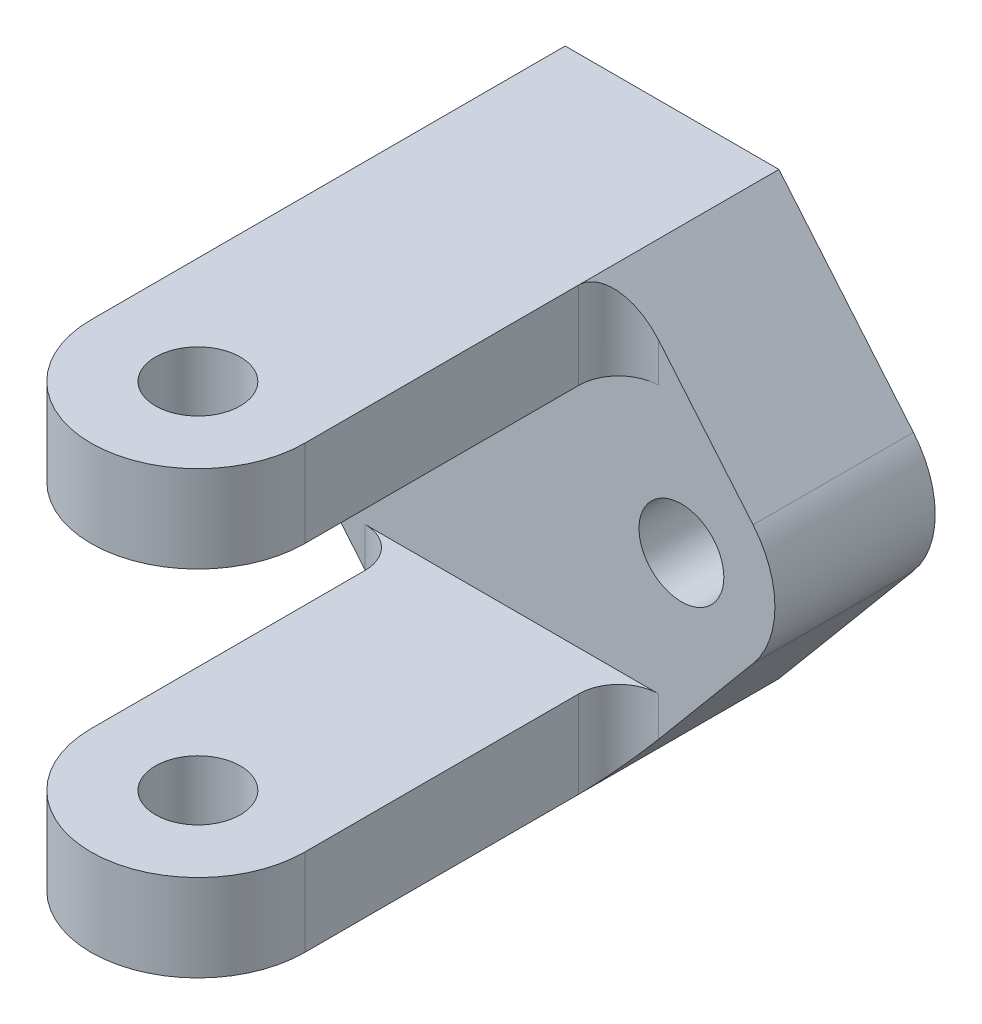
ISO-10303-21;
HEADER;
FILE_DESCRIPTION(('STEP AP214'),'2;1');
FILE_NAME('part.step','',(''),(''),'','','');
FILE_SCHEMA(('AUTOMOTIVE_DESIGN { 1 0 10303 214 1 1 1 1 }'));
ENDSEC;
DATA;
#1=APPLICATION_CONTEXT('core data for automotive mechanical design processes');
#2=APPLICATION_PROTOCOL_DEFINITION('international standard','automotive_design',2000,#1);
#3=PRODUCT_CONTEXT('',#1,'mechanical');
#4=PRODUCT('Part','Part','',(#3));
#5=PRODUCT_RELATED_PRODUCT_CATEGORY('part','',(#4));
#6=PRODUCT_DEFINITION_FORMATION('','',#4);
#7=PRODUCT_DEFINITION_CONTEXT('part definition',#1,'design');
#8=PRODUCT_DEFINITION('design','',#6,#7);
#9=PRODUCT_DEFINITION_SHAPE('','',#8);
#10=(LENGTH_UNIT() NAMED_UNIT(*) SI_UNIT(.MILLI.,.METRE.));
#11=(NAMED_UNIT(*) PLANE_ANGLE_UNIT() SI_UNIT($,.RADIAN.));
#12=(NAMED_UNIT(*) SI_UNIT($,.STERADIAN.) SOLID_ANGLE_UNIT());
#13=UNCERTAINTY_MEASURE_WITH_UNIT(LENGTH_MEASURE(1.E-05),#10,'distance_accuracy_value','');
#14=(GEOMETRIC_REPRESENTATION_CONTEXT(3) GLOBAL_UNCERTAINTY_ASSIGNED_CONTEXT((#13)) GLOBAL_UNIT_ASSIGNED_CONTEXT((#10,
#11,#12)) REPRESENTATION_CONTEXT('',''));
#15=CARTESIAN_POINT('',(0.,0.,0.));
#16=DIRECTION('',(0.,0.,1.));
#17=DIRECTION('',(1.,0.,0.));
#18=AXIS2_PLACEMENT_3D('',#15,#16,#17);
#19=CARTESIAN_POINT('',(-8.,-83.7629553253982,20.));
#20=DIRECTION('',(1.,0.,0.));
#21=DIRECTION('',(0.,0.,-1.));
#22=AXIS2_PLACEMENT_3D('',#19,#20,#21);
#23=PLANE('',#22);
#24=DIRECTION('',(0.,0.,1.));
#25=VECTOR('',#24,1.);
#26=CARTESIAN_POINT('',(-8.,16.51,20.));
#27=LINE('',#26,#25);
#28=CARTESIAN_POINT('',(-8.,16.51,15.));
#29=VERTEX_POINT('',#28);
#30=CARTESIAN_POINT('',(-8.,16.51,35.5));
#31=VERTEX_POINT('',#30);
#32=EDGE_CURVE('E193',#29,#31,#27,.T.);
#33=ORIENTED_EDGE('',*,*,#32,.F.);
#34=DIRECTION('',(0.,1.,0.));
#35=VECTOR('',#34,1.);
#36=CARTESIAN_POINT('',(-8.,9.99999999999999,15.));
#37=LINE('',#36,#35);
#38=CARTESIAN_POINT('',(-8.,10.,15.));
#39=VERTEX_POINT('',#38);
#40=EDGE_CURVE('E323',#29,#39,#37,.F.);
#41=ORIENTED_EDGE('',*,*,#40,.T.);
#42=DIRECTION('',(0.,0.,-1.));
#43=VECTOR('',#42,1.);
#44=CARTESIAN_POINT('',(-8.,10.,65.));
#45=LINE('',#44,#43);
#46=CARTESIAN_POINT('',(-8.,9.99999999999999,35.5));
#47=VERTEX_POINT('',#46);
#48=EDGE_CURVE('E249',#47,#39,#45,.T.);
#49=ORIENTED_EDGE('',*,*,#48,.F.);
#50=DIRECTION('',(0.,1.,0.));
#51=VECTOR('',#50,1.);
#52=CARTESIAN_POINT('',(-8.,-83.7629553253982,35.5));
#53=LINE('',#52,#51);
#54=EDGE_CURVE('E238',#47,#31,#53,.T.);
#55=ORIENTED_EDGE('',*,*,#54,.T.);
#56=EDGE_LOOP('',(#33,#41,#49,#55));
#57=FACE_BOUND('',#56,.T.);
#58=ADVANCED_FACE('F44',(#57),#23,.F.);
#59=CARTESIAN_POINT('',(8.,-83.7629553253982,35.5));
#60=DIRECTION('',(-1.,0.,0.));
#61=DIRECTION('',(0.,0.,1.));
#62=AXIS2_PLACEMENT_3D('',#59,#60,#61);
#63=PLANE('',#62);
#64=DIRECTION('',(0.,0.,1.));
#65=VECTOR('',#64,1.);
#66=CARTESIAN_POINT('',(8.,10.,65.));
#67=LINE('',#66,#65);
#68=CARTESIAN_POINT('',(8.,10.,15.));
#69=VERTEX_POINT('',#68);
#70=CARTESIAN_POINT('',(8.,9.99999999999999,35.5));
#71=VERTEX_POINT('',#70);
#72=EDGE_CURVE('E234',#69,#71,#67,.T.);
#73=ORIENTED_EDGE('',*,*,#72,.F.);
#74=DIRECTION('',(0.,1.,0.));
#75=VECTOR('',#74,1.);
#76=CARTESIAN_POINT('',(8.,16.51,15.));
#77=LINE('',#76,#75);
#78=CARTESIAN_POINT('',(8.,16.51,15.));
#79=VERTEX_POINT('',#78);
#80=EDGE_CURVE('E333',#69,#79,#77,.T.);
#81=ORIENTED_EDGE('',*,*,#80,.T.);
#82=DIRECTION('',(0.,0.,-1.));
#83=VECTOR('',#82,1.);
#84=CARTESIAN_POINT('',(8.,16.51,35.5));
#85=LINE('',#84,#83);
#86=CARTESIAN_POINT('',(8.,16.51,35.5));
#87=VERTEX_POINT('',#86);
#88=EDGE_CURVE('E218',#87,#79,#85,.T.);
#89=ORIENTED_EDGE('',*,*,#88,.F.);
#90=DIRECTION('',(0.,1.,0.));
#91=VECTOR('',#90,1.);
#92=CARTESIAN_POINT('',(8.,-83.7629553253982,35.5));
#93=LINE('',#92,#91);
#94=EDGE_CURVE('E222',#71,#87,#93,.T.);
#95=ORIENTED_EDGE('',*,*,#94,.F.);
#96=EDGE_LOOP('',(#73,#81,#89,#95));
#97=FACE_BOUND('',#96,.T.);
#98=ADVANCED_FACE('F383',(#97),#63,.F.);
#99=CARTESIAN_POINT('',(12.7,0.,47.3781062240477));
#100=DIRECTION('',(0.,0.,-1.));
#101=DIRECTION('',(-1.,0.,0.));
#102=AXIS2_PLACEMENT_3D('',#99,#100,#101);
#103=CYLINDRICAL_SURFACE('',#102,7.);
#104=CARTESIAN_POINT('',(12.7,0.,0.));
#105=DIRECTION('',(0.,0.,1.));
#106=DIRECTION('',(1.,0.,0.));
#107=AXIS2_PLACEMENT_3D('',#104,#105,#106);
#108=CIRCLE('',#107,7.);
#109=CARTESIAN_POINT('',(18.0657591468047,4.49540084736414,0.));
#110=VERTEX_POINT('',#109);
#111=CARTESIAN_POINT('',(18.0657591468047,-4.49540084736414,0.));
#112=VERTEX_POINT('',#111);
#113=EDGE_CURVE('E209',#110,#112,#108,.F.);
#114=ORIENTED_EDGE('',*,*,#113,.F.);
#115=DIRECTION('',(0.,0.,-1.));
#116=VECTOR('',#115,1.);
#117=CARTESIAN_POINT('',(18.0657591468047,4.49540084736414,27.6738667851937));
#118=LINE('',#117,#116);
#119=CARTESIAN_POINT('',(18.0657591468047,4.49540084736414,12.));
#120=VERTEX_POINT('',#119);
#121=EDGE_CURVE('E375',#120,#110,#118,.T.);
#122=ORIENTED_EDGE('',*,*,#121,.F.);
#123=CARTESIAN_POINT('',(12.7,0.,12.));
#124=DIRECTION('',(0.,0.,-1.));
#125=DIRECTION('',(-1.,0.,0.));
#126=AXIS2_PLACEMENT_3D('',#123,#124,#125);
#127=CIRCLE('',#126,7.);
#128=CARTESIAN_POINT('',(18.0657591468046,-4.49540084736413,12.));
#129=VERTEX_POINT('',#128);
#130=EDGE_CURVE('E200',#129,#120,#127,.F.);
#131=ORIENTED_EDGE('',*,*,#130,.F.);
#132=DIRECTION('',(0.,0.,-1.));
#133=VECTOR('',#132,1.);
#134=CARTESIAN_POINT('',(18.0657591468047,-4.49540084736414,27.6738667851937));
#135=LINE('',#134,#133);
#136=EDGE_CURVE('E203',#129,#112,#135,.T.);
#137=ORIENTED_EDGE('',*,*,#136,.T.);
#138=EDGE_LOOP('',(#114,#122,#131,#137));
#139=FACE_BOUND('',#138,.T.);
#140=ADVANCED_FACE('F445',(#139),#103,.T.);
#141=DIRECTION('',(0.,0.,1.));
#142=VECTOR('',#141,1.);
#143=CARTESIAN_POINT('',(-8.,-10.,65.));
#144=LINE('',#143,#142);
#145=CARTESIAN_POINT('',(-8.,-10.,15.));
#146=VERTEX_POINT('',#145);
#147=CARTESIAN_POINT('',(-8.,-9.99999999999999,35.5));
#148=VERTEX_POINT('',#147);
#149=EDGE_CURVE('E306',#146,#148,#144,.T.);
#150=ORIENTED_EDGE('',*,*,#149,.F.);
#151=DIRECTION('',(0.,-1.,0.));
#152=VECTOR('',#151,1.);
#153=CARTESIAN_POINT('',(-8.,-16.51,15.));
#154=LINE('',#153,#152);
#155=CARTESIAN_POINT('',(-8.,-16.51,15.));
#156=VERTEX_POINT('',#155);
#157=EDGE_CURVE('E326',#146,#156,#154,.T.);
#158=ORIENTED_EDGE('',*,*,#157,.T.);
#159=DIRECTION('',(0.,0.,1.));
#160=VECTOR('',#159,1.);
#161=CARTESIAN_POINT('',(-8.,-16.51,20.));
#162=LINE('',#161,#160);
#163=CARTESIAN_POINT('',(-8.,-16.51,35.5));
#164=VERTEX_POINT('',#163);
#165=EDGE_CURVE('E230',#156,#164,#162,.T.);
#166=ORIENTED_EDGE('',*,*,#165,.T.);
#167=EDGE_CURVE('E227',#164,#148,#53,.T.);
#168=ORIENTED_EDGE('',*,*,#167,.T.);
#169=EDGE_LOOP('',(#150,#158,#166,#168));
#170=FACE_BOUND('',#169,.T.);
#171=ADVANCED_FACE('F395',(#170),#23,.F.);
#172=CARTESIAN_POINT('',(-12.7,0.,47.3781062240477));
#173=DIRECTION('',(0.,0.,-1.));
#174=DIRECTION('',(-1.,0.,0.));
#175=AXIS2_PLACEMENT_3D('',#172,#173,#174);
#176=CYLINDRICAL_SURFACE('',#175,7.);
#177=CARTESIAN_POINT('',(-12.7,0.,12.));
#178=DIRECTION('',(0.,0.,-1.));
#179=DIRECTION('',(-1.,0.,0.));
#180=AXIS2_PLACEMENT_3D('',#177,#178,#179);
#181=CIRCLE('',#180,7.);
#182=CARTESIAN_POINT('',(-18.0657591468047,-4.49540084736414,12.));
#183=VERTEX_POINT('',#182);
#184=CARTESIAN_POINT('',(-18.0657591468047,4.49540084736414,12.));
#185=VERTEX_POINT('',#184);
#186=EDGE_CURVE('E172',#183,#185,#181,.T.);
#187=ORIENTED_EDGE('',*,*,#186,.T.);
#188=DIRECTION('',(0.,0.,-1.));
#189=VECTOR('',#188,1.);
#190=CARTESIAN_POINT('',(-18.0657591468047,4.49540084736414,27.6738667851937));
#191=LINE('',#190,#189);
#192=CARTESIAN_POINT('',(-18.0657591468047,4.49540084736414,0.));
#193=VERTEX_POINT('',#192);
#194=EDGE_CURVE('E179',#185,#193,#191,.T.);
#195=ORIENTED_EDGE('',*,*,#194,.T.);
#196=CARTESIAN_POINT('',(-12.7,0.,0.));
#197=DIRECTION('',(0.,0.,1.));
#198=DIRECTION('',(1.,0.,0.));
#199=AXIS2_PLACEMENT_3D('',#196,#197,#198);
#200=CIRCLE('',#199,7.);
#201=CARTESIAN_POINT('',(-18.0657591468046,-4.49540084736414,0.));
#202=VERTEX_POINT('',#201);
#203=EDGE_CURVE('E194',#193,#202,#200,.T.);
#204=ORIENTED_EDGE('',*,*,#203,.T.);
#205=DIRECTION('',(0.,0.,-1.));
#206=VECTOR('',#205,1.);
#207=CARTESIAN_POINT('',(-18.0657591468046,-4.49540084736414,27.6738667851937));
#208=LINE('',#207,#206);
#209=EDGE_CURVE('E191',#183,#202,#208,.T.);
#210=ORIENTED_EDGE('',*,*,#209,.F.);
#211=EDGE_LOOP('',(#187,#195,#204,#210));
#212=FACE_BOUND('',#211,.T.);
#213=ADVANCED_FACE('F189',(#212),#176,.T.);
#214=DIRECTION('',(0.,0.,-1.));
#215=VECTOR('',#214,1.);
#216=CARTESIAN_POINT('',(8.,-16.51,35.5));
#217=LINE('',#216,#215);
#218=CARTESIAN_POINT('',(8.,-16.51,35.5));
#219=VERTEX_POINT('',#218);
#220=CARTESIAN_POINT('',(8.,-16.51,15.));
#221=VERTEX_POINT('',#220);
#222=EDGE_CURVE('E223',#219,#221,#217,.T.);
#223=ORIENTED_EDGE('',*,*,#222,.T.);
#224=DIRECTION('',(0.,-1.,0.));
#225=VECTOR('',#224,1.);
#226=CARTESIAN_POINT('',(8.,-9.99999999999999,15.));
#227=LINE('',#226,#225);
#228=CARTESIAN_POINT('',(8.,-9.99999999999999,15.));
#229=VERTEX_POINT('',#228);
#230=EDGE_CURVE('E330',#221,#229,#227,.F.);
#231=ORIENTED_EDGE('',*,*,#230,.T.);
#232=DIRECTION('',(0.,0.,-1.));
#233=VECTOR('',#232,1.);
#234=CARTESIAN_POINT('',(8.,-9.99999999999999,65.));
#235=LINE('',#234,#233);
#236=CARTESIAN_POINT('',(8.,-9.99999999999999,35.5));
#237=VERTEX_POINT('',#236);
#238=EDGE_CURVE('E295',#237,#229,#235,.T.);
#239=ORIENTED_EDGE('',*,*,#238,.F.);
#240=EDGE_CURVE('E239',#219,#237,#93,.T.);
#241=ORIENTED_EDGE('',*,*,#240,.F.);
#242=EDGE_LOOP('',(#223,#231,#239,#241));
#243=FACE_BOUND('',#242,.T.);
#244=ADVANCED_FACE('F404',(#243),#63,.F.);
#245=CARTESIAN_POINT('',(0.,0.,12.));
#246=DIRECTION('',(0.,0.,-1.));
#247=DIRECTION('',(-1.,0.,0.));
#248=AXIS2_PLACEMENT_3D('',#245,#246,#247);
#249=PLANE('',#248);
#250=DIRECTION('',(1.,0.,0.));
#251=VECTOR('',#250,1.);
#252=CARTESIAN_POINT('',(-20.7,10.,12.));
#253=LINE('',#252,#251);
#254=CARTESIAN_POINT('',(-11.,10.,12.));
#255=VERTEX_POINT('',#254);
#256=CARTESIAN_POINT('',(11.,10.,12.));
#257=VERTEX_POINT('',#256);
#258=EDGE_CURVE('E269',#255,#257,#253,.T.);
#259=ORIENTED_EDGE('',*,*,#258,.F.);
#260=DIRECTION('',(0.,1.,0.));
#261=VECTOR('',#260,1.);
#262=CARTESIAN_POINT('',(-11.,16.51,12.));
#263=LINE('',#262,#261);
#264=CARTESIAN_POINT('',(-11.,12.9291675031933,12.));
#265=VERTEX_POINT('',#264);
#266=EDGE_CURVE('E175',#255,#265,#263,.T.);
#267=ORIENTED_EDGE('',*,*,#266,.T.);
#268=DIRECTION('',(0.64220012105202,0.766537020972093,0.));
#269=VECTOR('',#268,1.);
#270=CARTESIAN_POINT('',(-8.,16.51,12.));
#271=LINE('',#270,#269);
#272=EDGE_CURVE('E166',#185,#265,#271,.T.);
#273=ORIENTED_EDGE('',*,*,#272,.F.);
#274=ORIENTED_EDGE('',*,*,#186,.F.);
#275=DIRECTION('',(0.64220012105202,-0.766537020972093,0.));
#276=VECTOR('',#275,1.);
#277=CARTESIAN_POINT('',(-12.8280125042184,-10.7472319766351,12.));
#278=LINE('',#277,#276);
#279=CARTESIAN_POINT('',(-11.,-12.9291675031933,12.));
#280=VERTEX_POINT('',#279);
#281=EDGE_CURVE('E424',#183,#280,#278,.T.);
#282=ORIENTED_EDGE('',*,*,#281,.T.);
#283=DIRECTION('',(0.,-1.,0.));
#284=VECTOR('',#283,1.);
#285=CARTESIAN_POINT('',(-11.,-9.99999999999999,12.));
#286=LINE('',#285,#284);
#287=CARTESIAN_POINT('',(-11.,-10.,12.));
#288=VERTEX_POINT('',#287);
#289=EDGE_CURVE('E317',#280,#288,#286,.F.);
#290=ORIENTED_EDGE('',*,*,#289,.T.);
#291=DIRECTION('',(-1.,0.,0.));
#292=VECTOR('',#291,1.);
#293=CARTESIAN_POINT('',(-20.7,-10.,12.));
#294=LINE('',#293,#292);
#295=CARTESIAN_POINT('',(11.,-9.99999999999999,12.));
#296=VERTEX_POINT('',#295);
#297=EDGE_CURVE('E266',#296,#288,#294,.T.);
#298=ORIENTED_EDGE('',*,*,#297,.F.);
#299=DIRECTION('',(0.,-1.,0.));
#300=VECTOR('',#299,1.);
#301=CARTESIAN_POINT('',(11.,-16.51,12.));
#302=LINE('',#301,#300);
#303=CARTESIAN_POINT('',(11.,-12.9291675031933,12.));
#304=VERTEX_POINT('',#303);
#305=EDGE_CURVE('E313',#296,#304,#302,.T.);
#306=ORIENTED_EDGE('',*,*,#305,.T.);
#307=DIRECTION('',(-0.64220012105202,-0.766537020972093,0.));
#308=VECTOR('',#307,1.);
#309=CARTESIAN_POINT('',(12.8280125042185,-10.7472319766351,12.));
#310=LINE('',#309,#308);
#311=EDGE_CURVE('E211',#129,#304,#310,.T.);
#312=ORIENTED_EDGE('',*,*,#311,.F.);
#313=ORIENTED_EDGE('',*,*,#130,.T.);
#314=DIRECTION('',(-0.64220012105202,0.766537020972093,0.));
#315=VECTOR('',#314,1.);
#316=CARTESIAN_POINT('',(8.,16.51,12.));
#317=LINE('',#316,#315);
#318=CARTESIAN_POINT('',(11.,12.9291675031933,12.));
#319=VERTEX_POINT('',#318);
#320=EDGE_CURVE('E365',#120,#319,#317,.T.);
#321=ORIENTED_EDGE('',*,*,#320,.T.);
#322=DIRECTION('',(0.,1.,0.));
#323=VECTOR('',#322,1.);
#324=CARTESIAN_POINT('',(11.,9.99999999999999,12.));
#325=LINE('',#324,#323);
#326=EDGE_CURVE('E309',#319,#257,#325,.F.);
#327=ORIENTED_EDGE('',*,*,#326,.T.);
#328=EDGE_LOOP('',(#259,#267,#273,#274,#282,#290,#298,#306,#312,#313,#321,#327));
#329=FACE_BOUND('',#328,.T.);
#330=CARTESIAN_POINT('',(-12.7,0.,12.));
#331=DIRECTION('',(0.,0.,1.));
#332=DIRECTION('',(1.,0.,0.));
#333=AXIS2_PLACEMENT_3D('',#330,#331,#332);
#334=CIRCLE('',#333,3.175);
#335=CARTESIAN_POINT('',(-9.525,0.,12.));
#336=VERTEX_POINT('',#335);
#337=EDGE_CURVE('E273',#336,#336,#334,.T.);
#338=ORIENTED_EDGE('',*,*,#337,.F.);
#339=EDGE_LOOP('',(#338));
#340=FACE_BOUND('',#339,.T.);
#341=CARTESIAN_POINT('',(12.7,0.,12.));
#342=DIRECTION('',(0.,0.,1.));
#343=DIRECTION('',(1.,0.,0.));
#344=AXIS2_PLACEMENT_3D('',#341,#342,#343);
#345=CIRCLE('',#344,3.175);
#346=CARTESIAN_POINT('',(15.875,0.,12.));
#347=VERTEX_POINT('',#346);
#348=EDGE_CURVE('E281',#347,#347,#345,.T.);
#349=ORIENTED_EDGE('',*,*,#348,.F.);
#350=EDGE_LOOP('',(#349));
#351=FACE_BOUND('',#350,.T.);
#352=ADVANCED_FACE('F168',(#329,#340,#351),#249,.F.);
#353=CARTESIAN_POINT('',(0.,0.,0.));
#354=DIRECTION('',(0.,0.,-1.));
#355=DIRECTION('',(-1.,0.,0.));
#356=AXIS2_PLACEMENT_3D('',#353,#354,#355);
#357=PLANE('',#356);
#358=ORIENTED_EDGE('',*,*,#203,.F.);
#359=DIRECTION('',(-0.64220012105202,-0.766537020972093,0.));
#360=VECTOR('',#359,1.);
#361=CARTESIAN_POINT('',(-8.,16.51,0.));
#362=LINE('',#361,#360);
#363=CARTESIAN_POINT('',(-8.,16.51,0.));
#364=VERTEX_POINT('',#363);
#365=EDGE_CURVE('E184',#364,#193,#362,.T.);
#366=ORIENTED_EDGE('',*,*,#365,.F.);
#367=DIRECTION('',(-1.,0.,0.));
#368=VECTOR('',#367,1.);
#369=CARTESIAN_POINT('',(-20.7,16.51,0.));
#370=LINE('',#369,#368);
#371=CARTESIAN_POINT('',(8.,16.51,0.));
#372=VERTEX_POINT('',#371);
#373=EDGE_CURVE('E285',#372,#364,#370,.T.);
#374=ORIENTED_EDGE('',*,*,#373,.F.);
#375=DIRECTION('',(0.64220012105202,-0.766537020972093,0.));
#376=VECTOR('',#375,1.);
#377=CARTESIAN_POINT('',(8.,16.51,0.));
#378=LINE('',#377,#376);
#379=EDGE_CURVE('E427',#372,#110,#378,.T.);
#380=ORIENTED_EDGE('',*,*,#379,.T.);
#381=ORIENTED_EDGE('',*,*,#113,.T.);
#382=DIRECTION('',(0.64220012105202,0.766537020972093,0.));
#383=VECTOR('',#382,1.);
#384=CARTESIAN_POINT('',(12.8280125042185,-10.7472319766351,0.));
#385=LINE('',#384,#383);
#386=CARTESIAN_POINT('',(8.,-16.51,0.));
#387=VERTEX_POINT('',#386);
#388=EDGE_CURVE('E439',#387,#112,#385,.T.);
#389=ORIENTED_EDGE('',*,*,#388,.F.);
#390=DIRECTION('',(1.,0.,0.));
#391=VECTOR('',#390,1.);
#392=CARTESIAN_POINT('',(-20.7,-16.51,0.));
#393=LINE('',#392,#391);
#394=CARTESIAN_POINT('',(-8.,-16.51,0.));
#395=VERTEX_POINT('',#394);
#396=EDGE_CURVE('E292',#395,#387,#393,.T.);
#397=ORIENTED_EDGE('',*,*,#396,.F.);
#398=DIRECTION('',(-0.64220012105202,0.766537020972093,0.));
#399=VECTOR('',#398,1.);
#400=CARTESIAN_POINT('',(-12.8280125042184,-10.7472319766351,0.));
#401=LINE('',#400,#399);
#402=EDGE_CURVE('E431',#395,#202,#401,.T.);
#403=ORIENTED_EDGE('',*,*,#402,.T.);
#404=EDGE_LOOP('',(#358,#366,#374,#380,#381,#389,#397,#403));
#405=FACE_BOUND('',#404,.T.);
#406=CARTESIAN_POINT('',(12.7,0.,0.));
#407=DIRECTION('',(0.,0.,1.));
#408=DIRECTION('',(1.,0.,0.));
#409=AXIS2_PLACEMENT_3D('',#406,#407,#408);
#410=CIRCLE('',#409,3.175);
#411=CARTESIAN_POINT('',(15.875,0.,0.));
#412=VERTEX_POINT('',#411);
#413=EDGE_CURVE('E277',#412,#412,#410,.T.);
#414=ORIENTED_EDGE('',*,*,#413,.T.);
#415=EDGE_LOOP('',(#414));
#416=FACE_BOUND('',#415,.T.);
#417=CARTESIAN_POINT('',(-12.7,0.,0.));
#418=DIRECTION('',(0.,0.,1.));
#419=DIRECTION('',(1.,0.,0.));
#420=AXIS2_PLACEMENT_3D('',#417,#418,#419);
#421=CIRCLE('',#420,3.175);
#422=CARTESIAN_POINT('',(-9.525,0.,0.));
#423=VERTEX_POINT('',#422);
#424=EDGE_CURVE('E272',#423,#423,#421,.T.);
#425=ORIENTED_EDGE('',*,*,#424,.T.);
#426=EDGE_LOOP('',(#425));
#427=FACE_BOUND('',#426,.T.);
#428=ADVANCED_FACE('F448',(#405,#416,#427),#357,.T.);
#429=CARTESIAN_POINT('',(-20.7,16.51,12.));
#430=DIRECTION('',(0.,-1.,0.));
#431=DIRECTION('',(0.,0.,-1.));
#432=AXIS2_PLACEMENT_3D('',#429,#430,#431);
#433=PLANE('',#432);
#434=CARTESIAN_POINT('',(0.,16.51,35.5));
#435=DIRECTION('',(0.,-1.,0.));
#436=DIRECTION('',(0.,0.,-1.));
#437=AXIS2_PLACEMENT_3D('',#434,#435,#436);
#438=CIRCLE('',#437,3.175);
#439=CARTESIAN_POINT('',(0.,16.51,38.675));
#440=VERTEX_POINT('',#439);
#441=EDGE_CURVE('E253',#440,#440,#438,.T.);
#442=ORIENTED_EDGE('',*,*,#441,.T.);
#443=EDGE_LOOP('',(#442));
#444=FACE_BOUND('',#443,.T.);
#445=ORIENTED_EDGE('',*,*,#373,.T.);
#446=EDGE_CURVE('E198',#364,#29,#27,.T.);
#447=ORIENTED_EDGE('',*,*,#446,.T.);
#448=ORIENTED_EDGE('',*,*,#32,.T.);
#449=CARTESIAN_POINT('',(0.,16.51,35.5));
#450=DIRECTION('',(0.,-1.,0.));
#451=DIRECTION('',(0.,0.,-1.));
#452=AXIS2_PLACEMENT_3D('',#449,#450,#451);
#453=CIRCLE('',#452,8.);
#454=EDGE_CURVE('E214',#31,#87,#453,.F.);
#455=ORIENTED_EDGE('',*,*,#454,.T.);
#456=ORIENTED_EDGE('',*,*,#88,.T.);
#457=DIRECTION('',(0.,0.,-1.));
#458=VECTOR('',#457,1.);
#459=CARTESIAN_POINT('',(8.,16.51,27.6738667851937));
#460=LINE('',#459,#458);
#461=EDGE_CURVE('E367',#79,#372,#460,.T.);
#462=ORIENTED_EDGE('',*,*,#461,.T.);
#463=EDGE_LOOP('',(#445,#447,#448,#455,#456,#462));
#464=FACE_BOUND('',#463,.T.);
#465=ADVANCED_FACE('F459',(#444,#464),#433,.F.);
#466=CARTESIAN_POINT('',(-20.7,-16.51,12.));
#467=DIRECTION('',(0.,1.,0.));
#468=DIRECTION('',(0.,0.,1.));
#469=AXIS2_PLACEMENT_3D('',#466,#467,#468);
#470=PLANE('',#469);
#471=CARTESIAN_POINT('',(0.,-16.51,35.5));
#472=DIRECTION('',(0.,1.,0.));
#473=DIRECTION('',(0.,0.,1.));
#474=AXIS2_PLACEMENT_3D('',#471,#472,#473);
#475=CIRCLE('',#474,3.175);
#476=CARTESIAN_POINT('',(0.,-16.51,38.675));
#477=VERTEX_POINT('',#476);
#478=EDGE_CURVE('E257',#477,#477,#475,.F.);
#479=ORIENTED_EDGE('',*,*,#478,.F.);
#480=EDGE_LOOP('',(#479));
#481=FACE_BOUND('',#480,.T.);
#482=EDGE_CURVE('E231',#395,#156,#162,.T.);
#483=ORIENTED_EDGE('',*,*,#482,.F.);
#484=ORIENTED_EDGE('',*,*,#396,.T.);
#485=DIRECTION('',(0.,0.,-1.));
#486=VECTOR('',#485,1.);
#487=CARTESIAN_POINT('',(8.,-16.51,27.6738667851937));
#488=LINE('',#487,#486);
#489=EDGE_CURVE('E61',#221,#387,#488,.T.);
#490=ORIENTED_EDGE('',*,*,#489,.F.);
#491=ORIENTED_EDGE('',*,*,#222,.F.);
#492=CARTESIAN_POINT('',(0.,-16.51,35.5));
#493=DIRECTION('',(0.,1.,0.));
#494=DIRECTION('',(0.,0.,1.));
#495=AXIS2_PLACEMENT_3D('',#492,#493,#494);
#496=CIRCLE('',#495,8.);
#497=EDGE_CURVE('E226',#164,#219,#496,.T.);
#498=ORIENTED_EDGE('',*,*,#497,.F.);
#499=ORIENTED_EDGE('',*,*,#165,.F.);
#500=EDGE_LOOP('',(#483,#484,#490,#491,#498,#499));
#501=FACE_BOUND('',#500,.T.);
#502=ADVANCED_FACE('F402',(#481,#501),#470,.F.);
#503=CARTESIAN_POINT('',(12.7,0.,12.));
#504=DIRECTION('',(0.,0.,-1.));
#505=DIRECTION('',(-1.,0.,0.));
#506=AXIS2_PLACEMENT_3D('',#503,#504,#505);
#507=CYLINDRICAL_SURFACE('',#506,3.175);
#508=ORIENTED_EDGE('',*,*,#348,.T.);
#509=EDGE_LOOP('',(#508));
#510=FACE_BOUND('',#509,.T.);
#511=ORIENTED_EDGE('',*,*,#413,.F.);
#512=EDGE_LOOP('',(#511));
#513=FACE_BOUND('',#512,.T.);
#514=ADVANCED_FACE('F580',(#510,#513),#507,.F.);
#515=CARTESIAN_POINT('',(-12.7,0.,12.));
#516=DIRECTION('',(0.,0.,-1.));
#517=DIRECTION('',(-1.,0.,0.));
#518=AXIS2_PLACEMENT_3D('',#515,#516,#517);
#519=CYLINDRICAL_SURFACE('',#518,3.175);
#520=ORIENTED_EDGE('',*,*,#337,.T.);
#521=EDGE_LOOP('',(#520));
#522=FACE_BOUND('',#521,.T.);
#523=ORIENTED_EDGE('',*,*,#424,.F.);
#524=EDGE_LOOP('',(#523));
#525=FACE_BOUND('',#524,.T.);
#526=ADVANCED_FACE('F568',(#522,#525),#519,.F.);
#527=CARTESIAN_POINT('',(-20.7,10.,65.));
#528=DIRECTION('',(0.,1.,0.));
#529=DIRECTION('',(0.,0.,1.));
#530=AXIS2_PLACEMENT_3D('',#527,#528,#529);
#531=PLANE('',#530);
#532=CARTESIAN_POINT('',(0.,10.,35.5));
#533=DIRECTION('',(0.,1.,0.));
#534=DIRECTION('',(0.,0.,1.));
#535=AXIS2_PLACEMENT_3D('',#532,#533,#534);
#536=CIRCLE('',#535,3.175);
#537=CARTESIAN_POINT('',(0.,10.,38.675));
#538=VERTEX_POINT('',#537);
#539=EDGE_CURVE('E262',#538,#538,#536,.T.);
#540=ORIENTED_EDGE('',*,*,#539,.T.);
#541=EDGE_LOOP('',(#540));
#542=FACE_BOUND('',#541,.T.);
#543=CARTESIAN_POINT('',(0.,9.99999999999999,35.5));
#544=DIRECTION('',(0.,1.,0.));
#545=DIRECTION('',(0.,0.,1.));
#546=AXIS2_PLACEMENT_3D('',#543,#544,#545);
#547=CIRCLE('',#546,8.);
#548=EDGE_CURVE('E245',#71,#47,#547,.F.);
#549=ORIENTED_EDGE('',*,*,#548,.T.);
#550=ORIENTED_EDGE('',*,*,#48,.T.);
#551=CARTESIAN_POINT('',(-11.,10.,15.));
#552=DIRECTION('',(0.,1.,0.));
#553=DIRECTION('',(0.,0.,1.));
#554=AXIS2_PLACEMENT_3D('',#551,#552,#553);
#555=CIRCLE('',#554,3.);
#556=EDGE_CURVE('E340',#39,#255,#555,.T.);
#557=ORIENTED_EDGE('',*,*,#556,.T.);
#558=ORIENTED_EDGE('',*,*,#258,.T.);
#559=CARTESIAN_POINT('',(11.,9.99999999999999,15.));
#560=DIRECTION('',(0.,1.,0.));
#561=DIRECTION('',(0.,0.,1.));
#562=AXIS2_PLACEMENT_3D('',#559,#560,#561);
#563=CIRCLE('',#562,3.);
#564=EDGE_CURVE('E11',#257,#69,#563,.T.);
#565=ORIENTED_EDGE('',*,*,#564,.T.);
#566=ORIENTED_EDGE('',*,*,#72,.T.);
#567=EDGE_LOOP('',(#549,#550,#557,#558,#565,#566));
#568=FACE_BOUND('',#567,.T.);
#569=ADVANCED_FACE('F379',(#542,#568),#531,.F.);
#570=CARTESIAN_POINT('',(-20.7,-10.,65.));
#571=DIRECTION('',(0.,-1.,0.));
#572=DIRECTION('',(1.,0.,0.));
#573=AXIS2_PLACEMENT_3D('',#570,#571,#572);
#574=PLANE('',#573);
#575=CARTESIAN_POINT('',(0.,-9.99999999999999,35.5));
#576=DIRECTION('',(0.,-1.,0.));
#577=DIRECTION('',(1.,0.,0.));
#578=AXIS2_PLACEMENT_3D('',#575,#576,#577);
#579=CIRCLE('',#578,3.175);
#580=CARTESIAN_POINT('',(0.,-9.99999999999999,38.675));
#581=VERTEX_POINT('',#580);
#582=EDGE_CURVE('E261',#581,#581,#579,.T.);
#583=ORIENTED_EDGE('',*,*,#582,.T.);
#584=EDGE_LOOP('',(#583));
#585=FACE_BOUND('',#584,.T.);
#586=ORIENTED_EDGE('',*,*,#297,.T.);
#587=CARTESIAN_POINT('',(-11.,-10.,15.));
#588=DIRECTION('',(0.,-1.,0.));
#589=DIRECTION('',(1.,0.,0.));
#590=AXIS2_PLACEMENT_3D('',#587,#588,#589);
#591=CIRCLE('',#590,3.);
#592=EDGE_CURVE('E347',#288,#146,#591,.T.);
#593=ORIENTED_EDGE('',*,*,#592,.T.);
#594=ORIENTED_EDGE('',*,*,#149,.T.);
#595=CARTESIAN_POINT('',(0.,-9.99999999999999,35.5));
#596=DIRECTION('',(0.,-1.,0.));
#597=DIRECTION('',(1.,0.,0.));
#598=AXIS2_PLACEMENT_3D('',#595,#596,#597);
#599=CIRCLE('',#598,8.);
#600=EDGE_CURVE('E302',#148,#237,#599,.F.);
#601=ORIENTED_EDGE('',*,*,#600,.T.);
#602=ORIENTED_EDGE('',*,*,#238,.T.);
#603=CARTESIAN_POINT('',(11.,-9.99999999999999,15.));
#604=DIRECTION('',(0.,-1.,0.));
#605=DIRECTION('',(1.,0.,0.));
#606=AXIS2_PLACEMENT_3D('',#603,#604,#605);
#607=CIRCLE('',#606,3.);
#608=EDGE_CURVE('E354',#229,#296,#607,.T.);
#609=ORIENTED_EDGE('',*,*,#608,.T.);
#610=EDGE_LOOP('',(#586,#593,#594,#601,#602,#609));
#611=FACE_BOUND('',#610,.T.);
#612=ADVANCED_FACE('F416',(#585,#611),#574,.F.);
#613=CARTESIAN_POINT('',(0.,-25.4902561210691,35.5));
#614=DIRECTION('',(0.,1.,0.));
#615=DIRECTION('',(0.,0.,1.));
#616=AXIS2_PLACEMENT_3D('',#613,#614,#615);
#617=CYLINDRICAL_SURFACE('',#616,3.175);
#618=CARTESIAN_POINT('',(0.,-16.51,38.675));
#619=CARTESIAN_POINT('',(0.,-16.4421875,38.675));
#620=CARTESIAN_POINT('',(0.,-16.374375,38.675));
#621=CARTESIAN_POINT('',(0.,-16.23875,38.675));
#622=CARTESIAN_POINT('',(0.,-16.1709375,38.675));
#623=CARTESIAN_POINT('',(0.,-16.0353125,38.675));
#624=CARTESIAN_POINT('',(0.,-15.9675,38.675));
#625=CARTESIAN_POINT('',(0.,-15.831875,38.675));
#626=CARTESIAN_POINT('',(0.,-15.7640625,38.675));
#627=CARTESIAN_POINT('',(0.,-15.6284375,38.675));
#628=CARTESIAN_POINT('',(0.,-15.560625,38.675));
#629=CARTESIAN_POINT('',(0.,-15.425,38.675));
#630=CARTESIAN_POINT('',(0.,-15.3571875,38.675));
#631=CARTESIAN_POINT('',(0.,-15.2215625,38.675));
#632=CARTESIAN_POINT('',(0.,-15.15375,38.675));
#633=CARTESIAN_POINT('',(0.,-15.018125,38.675));
#634=CARTESIAN_POINT('',(0.,-14.9503125,38.675));
#635=CARTESIAN_POINT('',(0.,-14.8146875,38.675));
#636=CARTESIAN_POINT('',(0.,-14.746875,38.675));
#637=CARTESIAN_POINT('',(0.,-14.61125,38.675));
#638=CARTESIAN_POINT('',(0.,-14.5434375,38.675));
#639=CARTESIAN_POINT('',(0.,-14.4078125,38.675));
#640=CARTESIAN_POINT('',(0.,-14.34,38.675));
#641=CARTESIAN_POINT('',(0.,-14.204375,38.675));
#642=CARTESIAN_POINT('',(0.,-14.1365625,38.675));
#643=CARTESIAN_POINT('',(0.,-14.0009375,38.675));
#644=CARTESIAN_POINT('',(0.,-13.933125,38.675));
#645=CARTESIAN_POINT('',(0.,-13.7975,38.675));
#646=CARTESIAN_POINT('',(0.,-13.7296875,38.675));
#647=CARTESIAN_POINT('',(0.,-13.5940625,38.675));
#648=CARTESIAN_POINT('',(0.,-13.52625,38.675));
#649=CARTESIAN_POINT('',(0.,-13.390625,38.675));
#650=CARTESIAN_POINT('',(0.,-13.3228125,38.675));
#651=CARTESIAN_POINT('',(0.,-13.1871875,38.675));
#652=CARTESIAN_POINT('',(0.,-13.119375,38.675));
#653=CARTESIAN_POINT('',(0.,-12.98375,38.675));
#654=CARTESIAN_POINT('',(0.,-12.9159375,38.675));
#655=CARTESIAN_POINT('',(0.,-12.7803125,38.675));
#656=CARTESIAN_POINT('',(0.,-12.7125,38.675));
#657=CARTESIAN_POINT('',(0.,-12.576875,38.675));
#658=CARTESIAN_POINT('',(0.,-12.5090625,38.675));
#659=CARTESIAN_POINT('',(0.,-12.3734375,38.675));
#660=CARTESIAN_POINT('',(0.,-12.305625,38.675));
#661=CARTESIAN_POINT('',(0.,-12.17,38.675));
#662=CARTESIAN_POINT('',(0.,-12.1021875,38.675));
#663=CARTESIAN_POINT('',(0.,-11.9665625,38.675));
#664=CARTESIAN_POINT('',(0.,-11.89875,38.675));
#665=CARTESIAN_POINT('',(0.,-11.763125,38.675));
#666=CARTESIAN_POINT('',(0.,-11.6953125,38.675));
#667=CARTESIAN_POINT('',(0.,-11.5596875,38.675));
#668=CARTESIAN_POINT('',(0.,-11.491875,38.675));
#669=CARTESIAN_POINT('',(0.,-11.35625,38.675));
#670=CARTESIAN_POINT('',(0.,-11.2884375,38.675));
#671=CARTESIAN_POINT('',(0.,-11.1528125,38.675));
#672=CARTESIAN_POINT('',(0.,-11.085,38.675));
#673=CARTESIAN_POINT('',(0.,-10.949375,38.675));
#674=CARTESIAN_POINT('',(0.,-10.8815625,38.675));
#675=CARTESIAN_POINT('',(0.,-10.7459375,38.675));
#676=CARTESIAN_POINT('',(0.,-10.678125,38.675));
#677=CARTESIAN_POINT('',(0.,-10.5425,38.675));
#678=CARTESIAN_POINT('',(0.,-10.4746875,38.675));
#679=CARTESIAN_POINT('',(0.,-10.3390625,38.675));
#680=CARTESIAN_POINT('',(0.,-10.27125,38.675));
#681=CARTESIAN_POINT('',(0.,-10.135625,38.675));
#682=CARTESIAN_POINT('',(0.,-10.0678125,38.675));
#683=CARTESIAN_POINT('',(0.,-9.99999999999999,38.675));
#684=B_SPLINE_CURVE_WITH_KNOTS('',3,(#618,#619,#620,#621,#622,#623,#624,#625,#626,#627,#628,
#629,#630,#631,#632,#633,#634,#635,#636,#637,#638,#639,#640,#641,#642,#643,#644,#645,#646,#647,
#648,#649,#650,#651,#652,#653,#654,#655,#656,#657,#658,#659,#660,#661,#662,#663,#664,#665,#666,
#667,#668,#669,#670,#671,#672,#673,#674,#675,#676,#677,#678,#679,#680,#681,#682,#683),
.UNSPECIFIED.,.F.,.F.,(4,2,2,2,2,2,2,2,2,2,2,2,2,2,2,2,2,2,2,2,2,2,2,2,2,2,2,2,2,2,2,2,4),(0.,
0.2034375,0.406875000000001,0.610312500000001,0.813750000000002,1.0171875,1.220625,1.4240625,
1.6275,1.8309375,2.03437500000001,2.2378125,2.44125,2.6446875,2.84812500000001,3.05156250000001,
3.25500000000001,3.45843750000001,3.66187500000001,3.86531250000001,4.06875000000001,
4.27218750000001,4.47562500000001,4.67906250000001,4.88250000000001,5.08593750000001,
5.28937500000001,5.49281250000001,5.69625000000001,5.89968750000001,6.10312500000001,
6.30656250000001,6.51000000000001),.UNSPECIFIED.);
#685=EDGE_CURVE('BSEAM556',#477,#581,#684,.T.);
#686=ORIENTED_EDGE('',*,*,#478,.T.);
#687=ORIENTED_EDGE('',*,*,#582,.F.);
#688=ORIENTED_EDGE('',*,*,#685,.T.);
#689=ORIENTED_EDGE('',*,*,#685,.F.);
#690=EDGE_LOOP('',(#686,#688,#687,#689));
#691=FACE_BOUND('',#690,.T.);
#692=ADVANCED_FACE('F556',(#691),#617,.F.);
#693=CARTESIAN_POINT('',(0.,16.51,38.675));
#694=CARTESIAN_POINT('',(0.,16.4421875,38.675));
#695=CARTESIAN_POINT('',(0.,16.374375,38.675));
#696=CARTESIAN_POINT('',(0.,16.23875,38.675));
#697=CARTESIAN_POINT('',(0.,16.1709375,38.675));
#698=CARTESIAN_POINT('',(0.,16.0353125,38.675));
#699=CARTESIAN_POINT('',(0.,15.9675,38.675));
#700=CARTESIAN_POINT('',(0.,15.831875,38.675));
#701=CARTESIAN_POINT('',(0.,15.7640625,38.675));
#702=CARTESIAN_POINT('',(0.,15.6284375,38.675));
#703=CARTESIAN_POINT('',(0.,15.560625,38.675));
#704=CARTESIAN_POINT('',(0.,15.425,38.675));
#705=CARTESIAN_POINT('',(0.,15.3571875,38.675));
#706=CARTESIAN_POINT('',(0.,15.2215625,38.675));
#707=CARTESIAN_POINT('',(0.,15.15375,38.675));
#708=CARTESIAN_POINT('',(0.,15.018125,38.675));
#709=CARTESIAN_POINT('',(0.,14.9503125,38.675));
#710=CARTESIAN_POINT('',(0.,14.8146875,38.675));
#711=CARTESIAN_POINT('',(0.,14.746875,38.675));
#712=CARTESIAN_POINT('',(0.,14.61125,38.675));
#713=CARTESIAN_POINT('',(0.,14.5434375,38.675));
#714=CARTESIAN_POINT('',(0.,14.4078125,38.675));
#715=CARTESIAN_POINT('',(0.,14.34,38.675));
#716=CARTESIAN_POINT('',(0.,14.204375,38.675));
#717=CARTESIAN_POINT('',(0.,14.1365625,38.675));
#718=CARTESIAN_POINT('',(0.,14.0009375,38.675));
#719=CARTESIAN_POINT('',(0.,13.933125,38.675));
#720=CARTESIAN_POINT('',(0.,13.7975,38.675));
#721=CARTESIAN_POINT('',(0.,13.7296875,38.675));
#722=CARTESIAN_POINT('',(0.,13.5940625,38.675));
#723=CARTESIAN_POINT('',(0.,13.52625,38.675));
#724=CARTESIAN_POINT('',(0.,13.390625,38.675));
#725=CARTESIAN_POINT('',(0.,13.3228125,38.675));
#726=CARTESIAN_POINT('',(0.,13.1871875,38.675));
#727=CARTESIAN_POINT('',(0.,13.119375,38.675));
#728=CARTESIAN_POINT('',(0.,12.98375,38.675));
#729=CARTESIAN_POINT('',(0.,12.9159375,38.675));
#730=CARTESIAN_POINT('',(0.,12.7803125,38.675));
#731=CARTESIAN_POINT('',(0.,12.7125,38.675));
#732=CARTESIAN_POINT('',(0.,12.576875,38.675));
#733=CARTESIAN_POINT('',(0.,12.5090625,38.675));
#734=CARTESIAN_POINT('',(0.,12.3734375,38.675));
#735=CARTESIAN_POINT('',(0.,12.305625,38.675));
#736=CARTESIAN_POINT('',(0.,12.17,38.675));
#737=CARTESIAN_POINT('',(0.,12.1021875,38.675));
#738=CARTESIAN_POINT('',(0.,11.9665625,38.675));
#739=CARTESIAN_POINT('',(0.,11.89875,38.675));
#740=CARTESIAN_POINT('',(0.,11.763125,38.675));
#741=CARTESIAN_POINT('',(0.,11.6953125,38.675));
#742=CARTESIAN_POINT('',(0.,11.5596875,38.675));
#743=CARTESIAN_POINT('',(0.,11.491875,38.675));
#744=CARTESIAN_POINT('',(0.,11.35625,38.675));
#745=CARTESIAN_POINT('',(0.,11.2884375,38.675));
#746=CARTESIAN_POINT('',(0.,11.1528125,38.675));
#747=CARTESIAN_POINT('',(0.,11.085,38.675));
#748=CARTESIAN_POINT('',(0.,10.949375,38.675));
#749=CARTESIAN_POINT('',(0.,10.8815625,38.675));
#750=CARTESIAN_POINT('',(0.,10.7459375,38.675));
#751=CARTESIAN_POINT('',(0.,10.678125,38.675));
#752=CARTESIAN_POINT('',(0.,10.5425,38.675));
#753=CARTESIAN_POINT('',(0.,10.4746875,38.675));
#754=CARTESIAN_POINT('',(0.,10.3390625,38.675));
#755=CARTESIAN_POINT('',(0.,10.27125,38.675));
#756=CARTESIAN_POINT('',(0.,10.135625,38.675));
#757=CARTESIAN_POINT('',(0.,10.0678125,38.675));
#758=CARTESIAN_POINT('',(0.,10.,38.675));
#759=B_SPLINE_CURVE_WITH_KNOTS('',3,(#693,#694,#695,#696,#697,#698,#699,#700,#701,#702,#703,
#704,#705,#706,#707,#708,#709,#710,#711,#712,#713,#714,#715,#716,#717,#718,#719,#720,#721,#722,
#723,#724,#725,#726,#727,#728,#729,#730,#731,#732,#733,#734,#735,#736,#737,#738,#739,#740,#741,
#742,#743,#744,#745,#746,#747,#748,#749,#750,#751,#752,#753,#754,#755,#756,#757,#758),
.UNSPECIFIED.,.F.,.F.,(4,2,2,2,2,2,2,2,2,2,2,2,2,2,2,2,2,2,2,2,2,2,2,2,2,2,2,2,2,2,2,2,4),(0.,
0.2034375,0.406875000000001,0.610312500000001,0.813750000000002,1.0171875,1.220625,1.4240625,
1.6275,1.8309375,2.034375,2.2378125,2.44125,2.6446875,2.848125,3.0515625,3.255,3.4584375,
3.661875,3.8653125,4.06875,4.2721875,4.475625,4.6790625,4.8825,5.0859375,5.289375,5.4928125,
5.69625,5.8996875,6.103125,6.3065625,6.51),.UNSPECIFIED.);
#760=EDGE_CURVE('BSEAM664',#440,#538,#759,.T.);
#761=ORIENTED_EDGE('',*,*,#441,.F.);
#762=ORIENTED_EDGE('',*,*,#539,.F.);
#763=ORIENTED_EDGE('',*,*,#760,.T.);
#764=ORIENTED_EDGE('',*,*,#760,.F.);
#765=EDGE_LOOP('',(#761,#763,#762,#764));
#766=FACE_BOUND('',#765,.T.);
#767=ADVANCED_FACE('F664',(#766),#617,.F.);
#768=CARTESIAN_POINT('',(0.,-83.7629553253982,35.5));
#769=DIRECTION('',(0.,1.,0.));
#770=DIRECTION('',(0.,0.,1.));
#771=AXIS2_PLACEMENT_3D('',#768,#769,#770);
#772=CYLINDRICAL_SURFACE('',#771,8.);
#773=ORIENTED_EDGE('',*,*,#167,.F.);
#774=ORIENTED_EDGE('',*,*,#497,.T.);
#775=ORIENTED_EDGE('',*,*,#240,.T.);
#776=ORIENTED_EDGE('',*,*,#600,.F.);
#777=EDGE_LOOP('',(#773,#774,#775,#776));
#778=FACE_BOUND('',#777,.T.);
#779=ADVANCED_FACE('F400',(#778),#772,.T.);
#780=ORIENTED_EDGE('',*,*,#94,.T.);
#781=ORIENTED_EDGE('',*,*,#454,.F.);
#782=ORIENTED_EDGE('',*,*,#54,.F.);
#783=ORIENTED_EDGE('',*,*,#548,.F.);
#784=EDGE_LOOP('',(#780,#781,#782,#783));
#785=FACE_BOUND('',#784,.T.);
#786=ADVANCED_FACE('F462',(#785),#772,.T.);
#787=CARTESIAN_POINT('',(12.8280125042185,-10.7472319766351,27.6738667851937));
#788=DIRECTION('',(-0.766537020972093,0.64220012105202,0.));
#789=DIRECTION('',(-0.64220012105202,-0.766537020972093,0.));
#790=AXIS2_PLACEMENT_3D('',#787,#788,#789);
#791=PLANE('',#790);
#792=ORIENTED_EDGE('',*,*,#136,.F.);
#793=ORIENTED_EDGE('',*,*,#311,.T.);
#794=CARTESIAN_POINT('',(11.,-12.9291675031933,15.));
#795=DIRECTION('',(-0.766537020972093,0.64220012105202,0.));
#796=DIRECTION('',(0.64220012105202,0.766537020972093,0.));
#797=AXIS2_PLACEMENT_3D('',#794,#795,#796);
#798=ELLIPSE('',#797,4.67144103785834,3.);
#799=EDGE_CURVE('E350',#304,#221,#798,.T.);
#800=ORIENTED_EDGE('',*,*,#799,.T.);
#801=ORIENTED_EDGE('',*,*,#489,.T.);
#802=ORIENTED_EDGE('',*,*,#388,.T.);
#803=EDGE_LOOP('',(#792,#793,#800,#801,#802));
#804=FACE_BOUND('',#803,.T.);
#805=ADVANCED_FACE('F408',(#804),#791,.F.);
#806=CARTESIAN_POINT('',(-12.8280125042184,-10.7472319766351,27.6738667851937));
#807=DIRECTION('',(-0.766537020972093,-0.64220012105202,0.));
#808=DIRECTION('',(0.64220012105202,-0.766537020972093,0.));
#809=AXIS2_PLACEMENT_3D('',#806,#807,#808);
#810=PLANE('',#809);
#811=ORIENTED_EDGE('',*,*,#281,.F.);
#812=ORIENTED_EDGE('',*,*,#209,.T.);
#813=ORIENTED_EDGE('',*,*,#402,.F.);
#814=ORIENTED_EDGE('',*,*,#482,.T.);
#815=CARTESIAN_POINT('',(-11.,-12.9291675031933,15.));
#816=DIRECTION('',(-0.766537020972093,-0.64220012105202,0.));
#817=DIRECTION('',(-0.64220012105202,0.766537020972093,0.));
#818=AXIS2_PLACEMENT_3D('',#815,#816,#817);
#819=ELLIPSE('',#818,4.67144103785834,3.);
#820=EDGE_CURVE('E344',#156,#280,#819,.F.);
#821=ORIENTED_EDGE('',*,*,#820,.T.);
#822=EDGE_LOOP('',(#811,#812,#813,#814,#821));
#823=FACE_BOUND('',#822,.T.);
#824=ADVANCED_FACE('F423',(#823),#810,.T.);
#825=CARTESIAN_POINT('',(8.,16.51,27.6738667851937));
#826=DIRECTION('',(0.766537020972093,0.64220012105202,0.));
#827=DIRECTION('',(-0.64220012105202,0.766537020972093,0.));
#828=AXIS2_PLACEMENT_3D('',#825,#826,#827);
#829=PLANE('',#828);
#830=ORIENTED_EDGE('',*,*,#320,.F.);
#831=ORIENTED_EDGE('',*,*,#121,.T.);
#832=ORIENTED_EDGE('',*,*,#379,.F.);
#833=ORIENTED_EDGE('',*,*,#461,.F.);
#834=CARTESIAN_POINT('',(11.,12.9291675031933,15.));
#835=DIRECTION('',(0.766537020972093,0.64220012105202,0.));
#836=DIRECTION('',(0.64220012105202,-0.766537020972093,0.));
#837=AXIS2_PLACEMENT_3D('',#834,#835,#836);
#838=ELLIPSE('',#837,4.67144103785834,3.);
#839=EDGE_CURVE('E54',#79,#319,#838,.F.);
#840=ORIENTED_EDGE('',*,*,#839,.T.);
#841=EDGE_LOOP('',(#830,#831,#832,#833,#840));
#842=FACE_BOUND('',#841,.T.);
#843=ADVANCED_FACE('F363',(#842),#829,.T.);
#844=CARTESIAN_POINT('',(-8.,16.51,27.6738667851937));
#845=DIRECTION('',(0.766537020972093,-0.64220012105202,0.));
#846=DIRECTION('',(0.64220012105202,0.766537020972093,0.));
#847=AXIS2_PLACEMENT_3D('',#844,#845,#846);
#848=PLANE('',#847);
#849=ORIENTED_EDGE('',*,*,#194,.F.);
#850=ORIENTED_EDGE('',*,*,#272,.T.);
#851=CARTESIAN_POINT('',(-11.,12.9291675031933,15.));
#852=DIRECTION('',(0.766537020972093,-0.64220012105202,0.));
#853=DIRECTION('',(-0.64220012105202,-0.766537020972093,0.));
#854=AXIS2_PLACEMENT_3D('',#851,#852,#853);
#855=ELLIPSE('',#854,4.67144103785834,3.);
#856=EDGE_CURVE('E337',#265,#29,#855,.T.);
#857=ORIENTED_EDGE('',*,*,#856,.T.);
#858=ORIENTED_EDGE('',*,*,#446,.F.);
#859=ORIENTED_EDGE('',*,*,#365,.T.);
#860=EDGE_LOOP('',(#849,#850,#857,#858,#859));
#861=FACE_BOUND('',#860,.T.);
#862=ADVANCED_FACE('F182',(#861),#848,.F.);
#863=CARTESIAN_POINT('',(-11.,0.,15.));
#864=DIRECTION('',(0.,-1.,0.));
#865=DIRECTION('',(0.,0.,-1.));
#866=AXIS2_PLACEMENT_3D('',#863,#864,#865);
#867=CYLINDRICAL_SURFACE('',#866,3.);
#868=ORIENTED_EDGE('',*,*,#556,.F.);
#869=ORIENTED_EDGE('',*,*,#40,.F.);
#870=ORIENTED_EDGE('',*,*,#856,.F.);
#871=ORIENTED_EDGE('',*,*,#266,.F.);
#872=EDGE_LOOP('',(#868,#869,#870,#871));
#873=FACE_BOUND('',#872,.T.);
#874=ADVANCED_FACE('F467',(#873),#867,.F.);
#875=CARTESIAN_POINT('',(-11.,-83.7629553253982,15.));
#876=DIRECTION('',(0.,1.,0.));
#877=DIRECTION('',(0.,0.,1.));
#878=AXIS2_PLACEMENT_3D('',#875,#876,#877);
#879=CYLINDRICAL_SURFACE('',#878,3.);
#880=ORIENTED_EDGE('',*,*,#592,.F.);
#881=ORIENTED_EDGE('',*,*,#289,.F.);
#882=ORIENTED_EDGE('',*,*,#820,.F.);
#883=ORIENTED_EDGE('',*,*,#157,.F.);
#884=EDGE_LOOP('',(#880,#881,#882,#883));
#885=FACE_BOUND('',#884,.T.);
#886=ADVANCED_FACE('F420',(#885),#879,.F.);
#887=CARTESIAN_POINT('',(11.,0.,15.));
#888=DIRECTION('',(0.,1.,0.));
#889=DIRECTION('',(0.,0.,1.));
#890=AXIS2_PLACEMENT_3D('',#887,#888,#889);
#891=CYLINDRICAL_SURFACE('',#890,3.);
#892=ORIENTED_EDGE('',*,*,#608,.F.);
#893=ORIENTED_EDGE('',*,*,#230,.F.);
#894=ORIENTED_EDGE('',*,*,#799,.F.);
#895=ORIENTED_EDGE('',*,*,#305,.F.);
#896=EDGE_LOOP('',(#892,#893,#894,#895));
#897=FACE_BOUND('',#896,.T.);
#898=ADVANCED_FACE('F414',(#897),#891,.F.);
#899=CARTESIAN_POINT('',(11.,-83.7629553253982,15.));
#900=DIRECTION('',(0.,-1.,0.));
#901=DIRECTION('',(0.,0.,-1.));
#902=AXIS2_PLACEMENT_3D('',#899,#900,#901);
#903=CYLINDRICAL_SURFACE('',#902,3.);
#904=ORIENTED_EDGE('',*,*,#564,.F.);
#905=ORIENTED_EDGE('',*,*,#326,.F.);
#906=ORIENTED_EDGE('',*,*,#839,.F.);
#907=ORIENTED_EDGE('',*,*,#80,.F.);
#908=EDGE_LOOP('',(#904,#905,#906,#907));
#909=FACE_BOUND('',#908,.T.);
#910=ADVANCED_FACE('F46',(#909),#903,.F.);
#911=CLOSED_SHELL('',(#58,#98,#140,#171,#213,#244,#352,#428,#465,#502,#514,#526,#569,#612,#692,
#767,#779,#786,#805,#824,#843,#862,#874,#886,#898,#910));
#912=MANIFOLD_SOLID_BREP('B2',#911);
#913=ADVANCED_BREP_SHAPE_REPRESENTATION('',(#18,#912),#14);
#914=SHAPE_DEFINITION_REPRESENTATION(#9,#913);
ENDSEC;
END-ISO-10303-21;
